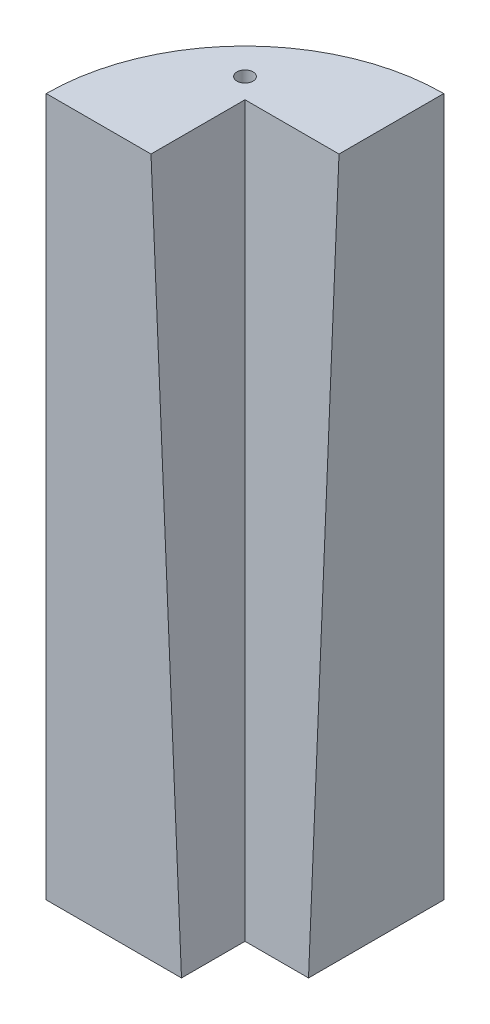
ISO-10303-21;
HEADER;
FILE_DESCRIPTION(('STEP AP214'),'2;1');
FILE_NAME('part.step','',(''),(''),'','','');
FILE_SCHEMA(('AUTOMOTIVE_DESIGN { 1 0 10303 214 1 1 1 1 }'));
ENDSEC;
DATA;
#1=APPLICATION_CONTEXT('core data for automotive mechanical design processes');
#2=APPLICATION_PROTOCOL_DEFINITION('international standard','automotive_design',2000,#1);
#3=PRODUCT_CONTEXT('',#1,'mechanical');
#4=PRODUCT('Part','Part','',(#3));
#5=PRODUCT_RELATED_PRODUCT_CATEGORY('part','',(#4));
#6=PRODUCT_DEFINITION_FORMATION('','',#4);
#7=PRODUCT_DEFINITION_CONTEXT('part definition',#1,'design');
#8=PRODUCT_DEFINITION('design','',#6,#7);
#9=PRODUCT_DEFINITION_SHAPE('','',#8);
#10=(LENGTH_UNIT() NAMED_UNIT(*) SI_UNIT(.MILLI.,.METRE.));
#11=(NAMED_UNIT(*) PLANE_ANGLE_UNIT() SI_UNIT($,.RADIAN.));
#12=(NAMED_UNIT(*) SI_UNIT($,.STERADIAN.) SOLID_ANGLE_UNIT());
#13=UNCERTAINTY_MEASURE_WITH_UNIT(LENGTH_MEASURE(1.E-05),#10,'distance_accuracy_value','');
#14=(GEOMETRIC_REPRESENTATION_CONTEXT(3) GLOBAL_UNCERTAINTY_ASSIGNED_CONTEXT((#13)) GLOBAL_UNIT_ASSIGNED_CONTEXT((#10,
#11,#12)) REPRESENTATION_CONTEXT('',''));
#15=CARTESIAN_POINT('',(0.,0.,0.));
#16=DIRECTION('',(0.,0.,1.));
#17=DIRECTION('',(1.,0.,0.));
#18=AXIS2_PLACEMENT_3D('',#15,#16,#17);
#19=CARTESIAN_POINT('',(0.,330.2,0.));
#20=DIRECTION('',(0.,-1.,0.));
#21=DIRECTION('',(0.,0.,-1.));
#22=AXIS2_PLACEMENT_3D('',#19,#20,#21);
#23=CYLINDRICAL_SURFACE('',#22,46.99);
#24=CARTESIAN_POINT('',(0.,165.1,0.));
#25=DIRECTION('',(0.,-1.,0.));
#26=DIRECTION('',(0.,0.,-1.));
#27=AXIS2_PLACEMENT_3D('',#24,#25,#26);
#28=CIRCLE('',#27,46.99);
#29=CARTESIAN_POINT('',(-46.99,165.1,0.));
#30=VERTEX_POINT('',#29);
#31=CARTESIAN_POINT('',(0.,165.1,-46.99));
#32=VERTEX_POINT('',#31);
#33=EDGE_CURVE('E111',#30,#32,#28,.T.);
#34=ORIENTED_EDGE('',*,*,#33,.F.);
#35=DIRECTION('',(0.,1.,0.));
#36=VECTOR('',#35,1.);
#37=CARTESIAN_POINT('',(-46.99,0.,0.));
#38=LINE('',#37,#36);
#39=CARTESIAN_POINT('',(-46.99,330.2,0.));
#40=VERTEX_POINT('',#39);
#41=EDGE_CURVE('E124',#30,#40,#38,.T.);
#42=ORIENTED_EDGE('',*,*,#41,.T.);
#43=CARTESIAN_POINT('',(0.,330.2,0.));
#44=DIRECTION('',(0.,1.,0.));
#45=DIRECTION('',(0.,0.,1.));
#46=AXIS2_PLACEMENT_3D('',#43,#44,#45);
#47=CIRCLE('',#46,46.99);
#48=CARTESIAN_POINT('',(0.,330.2,-46.99));
#49=VERTEX_POINT('',#48);
#50=EDGE_CURVE('E135',#49,#40,#47,.T.);
#51=ORIENTED_EDGE('',*,*,#50,.F.);
#52=DIRECTION('',(0.,1.,0.));
#53=VECTOR('',#52,1.);
#54=CARTESIAN_POINT('',(0.,0.,-46.99));
#55=LINE('',#54,#53);
#56=EDGE_CURVE('E125',#32,#49,#55,.T.);
#57=ORIENTED_EDGE('',*,*,#56,.F.);
#58=EDGE_LOOP('',(#34,#42,#51,#57));
#59=FACE_BOUND('',#58,.T.);
#60=ADVANCED_FACE('F41',(#59),#23,.T.);
#61=CARTESIAN_POINT('',(-22.225,330.2,-22.225));
#62=DIRECTION('',(-0.999048221581858,-0.0436193873653361,0.));
#63=DIRECTION('',(0.0436193873653361,-0.999048221581858,0.));
#64=AXIS2_PLACEMENT_3D('',#61,#62,#63);
#65=PLANE('',#64);
#66=DIRECTION('',(0.,0.,1.));
#67=VECTOR('',#66,1.);
#68=CARTESIAN_POINT('',(-15.0165783258046,165.1,-22.225));
#69=LINE('',#68,#67);
#70=CARTESIAN_POINT('',(-15.0165783258046,165.1,-15.0165783258046));
#71=VERTEX_POINT('',#70);
#72=CARTESIAN_POINT('',(-15.0165783258046,165.1,0.));
#73=VERTEX_POINT('',#72);
#74=EDGE_CURVE('E56',#71,#73,#69,.T.);
#75=ORIENTED_EDGE('',*,*,#74,.F.);
#76=DIRECTION('',(-0.0435779502517479,0.998099155647229,-0.0435779502517479));
#77=VECTOR('',#76,1.);
#78=CARTESIAN_POINT('',(-22.225,330.2,-22.225));
#79=LINE('',#78,#77);
#80=CARTESIAN_POINT('',(-22.225,330.2,-22.225));
#81=VERTEX_POINT('',#80);
#82=EDGE_CURVE('E133',#71,#81,#79,.T.);
#83=ORIENTED_EDGE('',*,*,#82,.T.);
#84=DIRECTION('',(0.,0.,1.));
#85=VECTOR('',#84,1.);
#86=CARTESIAN_POINT('',(-22.225,330.2,-22.225));
#87=LINE('',#86,#85);
#88=CARTESIAN_POINT('',(-22.225,330.2,0.));
#89=VERTEX_POINT('',#88);
#90=EDGE_CURVE('E127',#81,#89,#87,.T.);
#91=ORIENTED_EDGE('',*,*,#90,.T.);
#92=DIRECTION('',(0.0436193873653361,-0.999048221581858,0.));
#93=VECTOR('',#92,1.);
#94=CARTESIAN_POINT('',(-22.225,330.2,0.));
#95=LINE('',#94,#93);
#96=EDGE_CURVE('E11',#89,#73,#95,.T.);
#97=ORIENTED_EDGE('',*,*,#96,.T.);
#98=EDGE_LOOP('',(#75,#83,#91,#97));
#99=FACE_BOUND('',#98,.T.);
#100=ADVANCED_FACE('F152',(#99),#65,.F.);
#101=CARTESIAN_POINT('',(-22.225,330.2,-22.225));
#102=DIRECTION('',(0.,-0.0436193873653361,-0.999048221581858));
#103=DIRECTION('',(0.,0.999048221581858,-0.0436193873653361));
#104=AXIS2_PLACEMENT_3D('',#101,#102,#103);
#105=PLANE('',#104);
#106=DIRECTION('',(-1.,0.,0.));
#107=VECTOR('',#106,1.);
#108=CARTESIAN_POINT('',(-22.225,165.1,-15.0165783258046));
#109=LINE('',#108,#107);
#110=CARTESIAN_POINT('',(0.,165.1,-15.0165783258046));
#111=VERTEX_POINT('',#110);
#112=EDGE_CURVE('E113',#111,#71,#109,.T.);
#113=ORIENTED_EDGE('',*,*,#112,.F.);
#114=DIRECTION('',(0.,0.999048221581858,-0.0436193873653361));
#115=VECTOR('',#114,1.);
#116=CARTESIAN_POINT('',(0.,330.2,-22.225));
#117=LINE('',#116,#115);
#118=CARTESIAN_POINT('',(0.,330.2,-22.225));
#119=VERTEX_POINT('',#118);
#120=EDGE_CURVE('E49',#111,#119,#117,.T.);
#121=ORIENTED_EDGE('',*,*,#120,.T.);
#122=DIRECTION('',(-1.,0.,0.));
#123=VECTOR('',#122,1.);
#124=CARTESIAN_POINT('',(-22.225,330.2,-22.225));
#125=LINE('',#124,#123);
#126=EDGE_CURVE('E131',#119,#81,#125,.T.);
#127=ORIENTED_EDGE('',*,*,#126,.T.);
#128=ORIENTED_EDGE('',*,*,#82,.F.);
#129=EDGE_LOOP('',(#113,#121,#127,#128));
#130=FACE_BOUND('',#129,.T.);
#131=ADVANCED_FACE('F154',(#130),#105,.F.);
#132=CARTESIAN_POINT('',(0.,0.,-12.7));
#133=DIRECTION('',(-1.,0.,0.));
#134=DIRECTION('',(0.,0.,1.));
#135=AXIS2_PLACEMENT_3D('',#132,#133,#134);
#136=PLANE('',#135);
#137=DIRECTION('',(0.,0.,1.));
#138=VECTOR('',#137,1.);
#139=CARTESIAN_POINT('',(0.,165.1,0.));
#140=LINE('',#139,#138);
#141=EDGE_CURVE('E105',#32,#111,#140,.T.);
#142=ORIENTED_EDGE('',*,*,#141,.F.);
#143=ORIENTED_EDGE('',*,*,#56,.T.);
#144=DIRECTION('',(0.,0.,1.));
#145=VECTOR('',#144,1.);
#146=CARTESIAN_POINT('',(0.,330.2,-12.7));
#147=LINE('',#146,#145);
#148=EDGE_CURVE('E122',#49,#119,#147,.T.);
#149=ORIENTED_EDGE('',*,*,#148,.T.);
#150=ORIENTED_EDGE('',*,*,#120,.F.);
#151=EDGE_LOOP('',(#142,#143,#149,#150));
#152=FACE_BOUND('',#151,.T.);
#153=ADVANCED_FACE('F157',(#152),#136,.F.);
#154=CARTESIAN_POINT('',(-12.7,0.,0.));
#155=DIRECTION('',(0.,0.,-1.));
#156=DIRECTION('',(-1.,0.,0.));
#157=AXIS2_PLACEMENT_3D('',#154,#155,#156);
#158=PLANE('',#157);
#159=DIRECTION('',(-1.,0.,0.));
#160=VECTOR('',#159,1.);
#161=CARTESIAN_POINT('',(-46.99,165.1,0.));
#162=LINE('',#161,#160);
#163=EDGE_CURVE('E109',#73,#30,#162,.T.);
#164=ORIENTED_EDGE('',*,*,#163,.F.);
#165=ORIENTED_EDGE('',*,*,#96,.F.);
#166=DIRECTION('',(-1.,0.,0.));
#167=VECTOR('',#166,1.);
#168=CARTESIAN_POINT('',(-12.7,330.2,0.));
#169=LINE('',#168,#167);
#170=EDGE_CURVE('E119',#89,#40,#169,.T.);
#171=ORIENTED_EDGE('',*,*,#170,.T.);
#172=ORIENTED_EDGE('',*,*,#41,.F.);
#173=EDGE_LOOP('',(#164,#165,#171,#172));
#174=FACE_BOUND('',#173,.T.);
#175=ADVANCED_FACE('F150',(#174),#158,.F.);
#176=CARTESIAN_POINT('',(-26.9875,0.,-26.9875));
#177=DIRECTION('',(0.,1.,0.));
#178=DIRECTION('',(0.,0.,1.));
#179=AXIS2_PLACEMENT_3D('',#176,#177,#178);
#180=CYLINDRICAL_SURFACE('',#179,1.905);
#181=CARTESIAN_POINT('',(-26.9875,330.2,-26.9875));
#182=DIRECTION('',(0.,1.,0.));
#183=DIRECTION('',(0.,0.,1.));
#184=AXIS2_PLACEMENT_3D('',#181,#182,#183);
#185=CIRCLE('',#184,1.905);
#186=CARTESIAN_POINT('',(-26.9875,330.2,-25.0825));
#187=VERTEX_POINT('',#186);
#188=EDGE_CURVE('E116',#187,#187,#185,.T.);
#189=ORIENTED_EDGE('',*,*,#188,.T.);
#190=EDGE_LOOP('',(#189));
#191=FACE_BOUND('',#190,.T.);
#192=CARTESIAN_POINT('',(-26.9875,165.1,-26.9875));
#193=DIRECTION('',(0.,-1.,0.));
#194=DIRECTION('',(0.,0.,-1.));
#195=AXIS2_PLACEMENT_3D('',#192,#193,#194);
#196=CIRCLE('',#195,1.905);
#197=CARTESIAN_POINT('',(-26.9875,165.1,-28.8925));
#198=VERTEX_POINT('',#197);
#199=EDGE_CURVE('E44',#198,#198,#196,.F.);
#200=ORIENTED_EDGE('',*,*,#199,.F.);
#201=EDGE_LOOP('',(#200));
#202=FACE_BOUND('',#201,.T.);
#203=ADVANCED_FACE('F168',(#191,#202),#180,.F.);
#204=CARTESIAN_POINT('',(0.,330.2,0.));
#205=DIRECTION('',(0.,1.,0.));
#206=DIRECTION('',(0.,0.,1.));
#207=AXIS2_PLACEMENT_3D('',#204,#205,#206);
#208=PLANE('',#207);
#209=ORIENTED_EDGE('',*,*,#188,.F.);
#210=EDGE_LOOP('',(#209));
#211=FACE_BOUND('',#210,.T.);
#212=ORIENTED_EDGE('',*,*,#148,.F.);
#213=ORIENTED_EDGE('',*,*,#50,.T.);
#214=ORIENTED_EDGE('',*,*,#170,.F.);
#215=ORIENTED_EDGE('',*,*,#90,.F.);
#216=ORIENTED_EDGE('',*,*,#126,.F.);
#217=EDGE_LOOP('',(#212,#213,#214,#215,#216));
#218=FACE_BOUND('',#217,.T.);
#219=ADVANCED_FACE('F142',(#211,#218),#208,.T.);
#220=CARTESIAN_POINT('',(0.,165.1,0.));
#221=DIRECTION('',(0.,-1.,0.));
#222=DIRECTION('',(0.,0.,-1.));
#223=AXIS2_PLACEMENT_3D('',#220,#221,#222);
#224=PLANE('',#223);
#225=CARTESIAN_POINT('',(-12.7,165.1,-31.75));
#226=DIRECTION('',(0.,-1.,0.));
#227=DIRECTION('',(0.,0.,-1.));
#228=AXIS2_PLACEMENT_3D('',#225,#226,#227);
#229=CIRCLE('',#228,4.7625);
#230=CARTESIAN_POINT('',(-12.7,165.1,-36.5125));
#231=VERTEX_POINT('',#230);
#232=EDGE_CURVE('E100',#231,#231,#229,.T.);
#233=ORIENTED_EDGE('',*,*,#232,.F.);
#234=EDGE_LOOP('',(#233));
#235=FACE_BOUND('',#234,.T.);
#236=CARTESIAN_POINT('',(-31.75,165.1,-12.7));
#237=DIRECTION('',(0.,-1.,0.));
#238=DIRECTION('',(0.,0.,-1.));
#239=AXIS2_PLACEMENT_3D('',#236,#237,#238);
#240=CIRCLE('',#239,4.7625);
#241=CARTESIAN_POINT('',(-31.75,165.1,-17.4625));
#242=VERTEX_POINT('',#241);
#243=EDGE_CURVE('E102',#242,#242,#240,.T.);
#244=ORIENTED_EDGE('',*,*,#243,.F.);
#245=EDGE_LOOP('',(#244));
#246=FACE_BOUND('',#245,.T.);
#247=ORIENTED_EDGE('',*,*,#199,.T.);
#248=EDGE_LOOP('',(#247));
#249=FACE_BOUND('',#248,.T.);
#250=ORIENTED_EDGE('',*,*,#74,.T.);
#251=ORIENTED_EDGE('',*,*,#163,.T.);
#252=ORIENTED_EDGE('',*,*,#33,.T.);
#253=ORIENTED_EDGE('',*,*,#141,.T.);
#254=ORIENTED_EDGE('',*,*,#112,.T.);
#255=EDGE_LOOP('',(#250,#251,#252,#253,#254));
#256=FACE_BOUND('',#255,.T.);
#257=ADVANCED_FACE('F158',(#235,#246,#249,#256),#224,.T.);
#258=CARTESIAN_POINT('',(-31.75,165.1,-12.7));
#259=DIRECTION('',(0.,1.,0.));
#260=DIRECTION('',(0.,0.,-1.));
#261=AXIS2_PLACEMENT_3D('',#258,#259,#260);
#262=CONICAL_SURFACE('',#261,4.7625,0.78539816339745);
#263=CARTESIAN_POINT('',(-31.75,160.3375,-12.7));
#264=VERTEX_POINT('',#263);
#265=VERTEX_LOOP('',#264);
#266=FACE_BOUND('',#265,.T.);
#267=ORIENTED_EDGE('',*,*,#243,.T.);
#268=EDGE_LOOP('',(#267));
#269=FACE_BOUND('',#268,.T.);
#270=ADVANCED_FACE('F96',(#266,#269),#262,.T.);
#271=CARTESIAN_POINT('',(-12.7,165.1,-31.75));
#272=DIRECTION('',(0.,1.,0.));
#273=DIRECTION('',(0.,0.,-1.));
#274=AXIS2_PLACEMENT_3D('',#271,#272,#273);
#275=CONICAL_SURFACE('',#274,4.7625,0.78539816339745);
#276=CARTESIAN_POINT('',(-12.7,160.3375,-31.75));
#277=VERTEX_POINT('',#276);
#278=VERTEX_LOOP('',#277);
#279=FACE_BOUND('',#278,.T.);
#280=ORIENTED_EDGE('',*,*,#232,.T.);
#281=EDGE_LOOP('',(#280));
#282=FACE_BOUND('',#281,.T.);
#283=ADVANCED_FACE('F93',(#279,#282),#275,.T.);
#284=CLOSED_SHELL('',(#60,#100,#131,#153,#175,#203,#219,#257,#270,#283));
#285=MANIFOLD_SOLID_BREP('B2',#284);
#286=ADVANCED_BREP_SHAPE_REPRESENTATION('',(#18,#285),#14);
#287=SHAPE_DEFINITION_REPRESENTATION(#9,#286);
ENDSEC;
END-ISO-10303-21;
